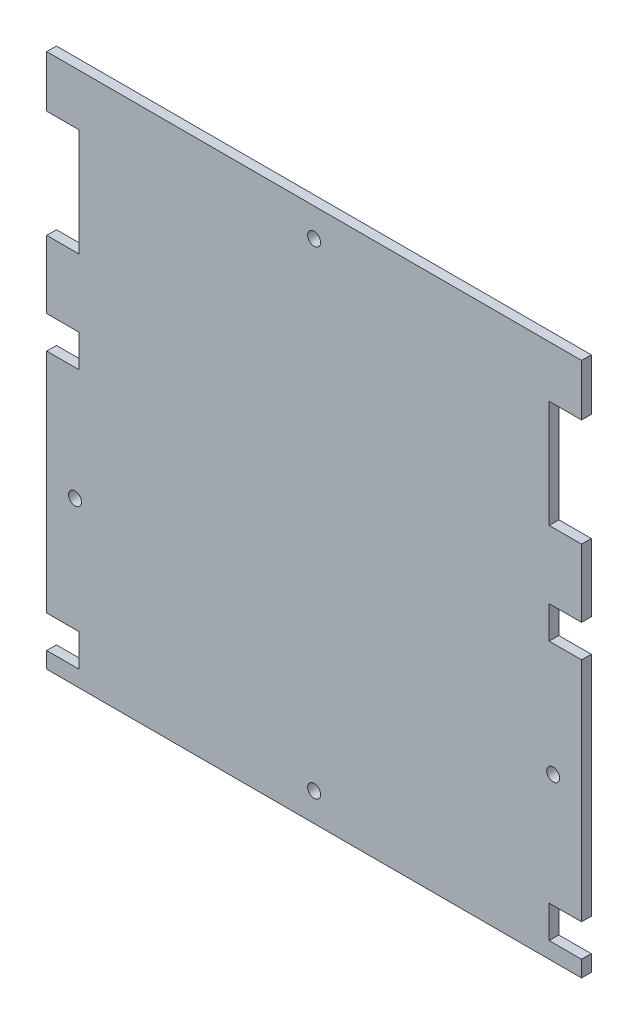
ISO-10303-21;
HEADER;
FILE_DESCRIPTION(('STEP AP214'),'2;1');
FILE_NAME('part.step','',(''),(''),'','','');
FILE_SCHEMA(('AUTOMOTIVE_DESIGN { 1 0 10303 214 1 1 1 1 }'));
ENDSEC;
DATA;
#1=APPLICATION_CONTEXT('core data for automotive mechanical design processes');
#2=APPLICATION_PROTOCOL_DEFINITION('international standard','automotive_design',2000,#1);
#3=PRODUCT_CONTEXT('',#1,'mechanical');
#4=PRODUCT('Part','Part','',(#3));
#5=PRODUCT_RELATED_PRODUCT_CATEGORY('part','',(#4));
#6=PRODUCT_DEFINITION_FORMATION('','',#4);
#7=PRODUCT_DEFINITION_CONTEXT('part definition',#1,'design');
#8=PRODUCT_DEFINITION('design','',#6,#7);
#9=PRODUCT_DEFINITION_SHAPE('','',#8);
#10=(LENGTH_UNIT() NAMED_UNIT(*) SI_UNIT(.MILLI.,.METRE.));
#11=(NAMED_UNIT(*) PLANE_ANGLE_UNIT() SI_UNIT($,.RADIAN.));
#12=(NAMED_UNIT(*) SI_UNIT($,.STERADIAN.) SOLID_ANGLE_UNIT());
#13=UNCERTAINTY_MEASURE_WITH_UNIT(LENGTH_MEASURE(1.E-05),#10,'distance_accuracy_value','');
#14=(GEOMETRIC_REPRESENTATION_CONTEXT(3) GLOBAL_UNCERTAINTY_ASSIGNED_CONTEXT((#13)) GLOBAL_UNIT_ASSIGNED_CONTEXT((#10,
#11,#12)) REPRESENTATION_CONTEXT('',''));
#15=CARTESIAN_POINT('',(0.,0.,0.));
#16=DIRECTION('',(0.,0.,1.));
#17=DIRECTION('',(1.,0.,0.));
#18=AXIS2_PLACEMENT_3D('',#15,#16,#17);
#19=CARTESIAN_POINT('',(0.,0.,3.));
#20=DIRECTION('',(0.,0.,1.));
#21=DIRECTION('',(1.,0.,0.));
#22=AXIS2_PLACEMENT_3D('',#19,#20,#21);
#23=PLANE('',#22);
#24=CARTESIAN_POINT('',(-7.2061657032755,-238.75,3.));
#25=DIRECTION('',(0.,0.,1.));
#26=DIRECTION('',(1.,0.,0.));
#27=AXIS2_PLACEMENT_3D('',#24,#25,#26);
#28=CIRCLE('',#27,2.);
#29=CARTESIAN_POINT('',(-5.2061657032755,-238.75,3.));
#30=VERTEX_POINT('',#29);
#31=EDGE_CURVE('E500',#30,#30,#28,.T.);
#32=ORIENTED_EDGE('',*,*,#31,.F.);
#33=EDGE_LOOP('',(#32));
#34=FACE_BOUND('',#33,.T.);
#35=CARTESIAN_POINT('',(-7.20616570327551,-91.25,3.));
#36=DIRECTION('',(0.,0.,1.));
#37=DIRECTION('',(1.,0.,0.));
#38=AXIS2_PLACEMENT_3D('',#35,#36,#37);
#39=CIRCLE('',#38,2.);
#40=CARTESIAN_POINT('',(-5.20616570327551,-91.25,3.));
#41=VERTEX_POINT('',#40);
#42=EDGE_CURVE('E254',#41,#41,#39,.T.);
#43=ORIENTED_EDGE('',*,*,#42,.F.);
#44=EDGE_LOOP('',(#43));
#45=FACE_BOUND('',#44,.T.);
#46=DIRECTION('',(0.,-1.,0.));
#47=VECTOR('',#46,1.);
#48=CARTESIAN_POINT('',(-89.7061657032755,-242.5,3.));
#49=LINE('',#48,#47);
#50=CARTESIAN_POINT('',(-89.7061657032755,-242.5,3.));
#51=VERTEX_POINT('',#50);
#52=CARTESIAN_POINT('',(-89.7061657032755,-247.5,3.));
#53=VERTEX_POINT('',#52);
#54=EDGE_CURVE('E305',#51,#53,#49,.T.);
#55=ORIENTED_EDGE('',*,*,#54,.T.);
#56=DIRECTION('',(1.,0.,0.));
#57=VECTOR('',#56,1.);
#58=CARTESIAN_POINT('',(-89.7061657032755,-247.5,3.));
#59=LINE('',#58,#57);
#60=CARTESIAN_POINT('',(75.2938342967245,-247.5,3.));
#61=VERTEX_POINT('',#60);
#62=EDGE_CURVE('E153',#53,#61,#59,.T.);
#63=ORIENTED_EDGE('',*,*,#62,.T.);
#64=DIRECTION('',(0.,1.,0.));
#65=VECTOR('',#64,1.);
#66=CARTESIAN_POINT('',(75.2938342967245,-247.5,3.));
#67=LINE('',#66,#65);
#68=CARTESIAN_POINT('',(75.2938342967245,-242.5,3.));
#69=VERTEX_POINT('',#68);
#70=EDGE_CURVE('E380',#61,#69,#67,.T.);
#71=ORIENTED_EDGE('',*,*,#70,.T.);
#72=DIRECTION('',(-1.,0.,0.));
#73=VECTOR('',#72,1.);
#74=CARTESIAN_POINT('',(75.2938342967245,-242.5,3.));
#75=LINE('',#74,#73);
#76=CARTESIAN_POINT('',(65.2938342967245,-242.5,3.));
#77=VERTEX_POINT('',#76);
#78=EDGE_CURVE('E399',#69,#77,#75,.T.);
#79=ORIENTED_EDGE('',*,*,#78,.T.);
#80=DIRECTION('',(0.,1.,0.));
#81=VECTOR('',#80,1.);
#82=CARTESIAN_POINT('',(65.2938342967245,-242.5,3.));
#83=LINE('',#82,#81);
#84=CARTESIAN_POINT('',(65.2938342967245,-232.5,3.));
#85=VERTEX_POINT('',#84);
#86=EDGE_CURVE('E396',#77,#85,#83,.T.);
#87=ORIENTED_EDGE('',*,*,#86,.T.);
#88=DIRECTION('',(1.,0.,0.));
#89=VECTOR('',#88,1.);
#90=CARTESIAN_POINT('',(65.2938342967245,-232.5,3.));
#91=LINE('',#90,#89);
#92=CARTESIAN_POINT('',(75.2938342967245,-232.5,3.));
#93=VERTEX_POINT('',#92);
#94=EDGE_CURVE('E398',#85,#93,#91,.T.);
#95=ORIENTED_EDGE('',*,*,#94,.T.);
#96=DIRECTION('',(0.,1.,0.));
#97=VECTOR('',#96,1.);
#98=CARTESIAN_POINT('',(75.2938342967245,-232.5,3.));
#99=LINE('',#98,#97);
#100=CARTESIAN_POINT('',(75.2938342967245,-162.5,3.));
#101=VERTEX_POINT('',#100);
#102=EDGE_CURVE('E401',#93,#101,#99,.T.);
#103=ORIENTED_EDGE('',*,*,#102,.T.);
#104=DIRECTION('',(-1.,0.,0.));
#105=VECTOR('',#104,1.);
#106=CARTESIAN_POINT('',(75.2938342967245,-162.5,3.));
#107=LINE('',#106,#105);
#108=CARTESIAN_POINT('',(65.2938342967245,-162.5,3.));
#109=VERTEX_POINT('',#108);
#110=EDGE_CURVE('E407',#101,#109,#107,.T.);
#111=ORIENTED_EDGE('',*,*,#110,.T.);
#112=DIRECTION('',(0.,1.,0.));
#113=VECTOR('',#112,1.);
#114=CARTESIAN_POINT('',(65.2938342967245,-162.5,3.));
#115=LINE('',#114,#113);
#116=CARTESIAN_POINT('',(65.2938342967245,-152.5,3.));
#117=VERTEX_POINT('',#116);
#118=EDGE_CURVE('E409',#109,#117,#115,.T.);
#119=ORIENTED_EDGE('',*,*,#118,.T.);
#120=DIRECTION('',(1.,0.,0.));
#121=VECTOR('',#120,1.);
#122=CARTESIAN_POINT('',(65.2938342967245,-152.5,3.));
#123=LINE('',#122,#121);
#124=CARTESIAN_POINT('',(75.2938342967245,-152.5,3.));
#125=VERTEX_POINT('',#124);
#126=EDGE_CURVE('E411',#117,#125,#123,.T.);
#127=ORIENTED_EDGE('',*,*,#126,.T.);
#128=DIRECTION('',(0.,1.,0.));
#129=VECTOR('',#128,1.);
#130=CARTESIAN_POINT('',(75.2938342967245,-152.5,3.));
#131=LINE('',#130,#129);
#132=CARTESIAN_POINT('',(75.2938342967245,-131.583123951777,3.));
#133=VERTEX_POINT('',#132);
#134=EDGE_CURVE('E413',#125,#133,#131,.T.);
#135=ORIENTED_EDGE('',*,*,#134,.T.);
#136=DIRECTION('',(-1.,0.,0.));
#137=VECTOR('',#136,1.);
#138=CARTESIAN_POINT('',(75.2938342967245,-131.583123951777,3.));
#139=LINE('',#138,#137);
#140=CARTESIAN_POINT('',(65.2938342967245,-131.583123951777,3.));
#141=VERTEX_POINT('',#140);
#142=EDGE_CURVE('E415',#133,#141,#139,.T.);
#143=ORIENTED_EDGE('',*,*,#142,.T.);
#144=DIRECTION('',(0.,1.,0.));
#145=VECTOR('',#144,1.);
#146=CARTESIAN_POINT('',(65.2938342967245,-131.583123951777,3.));
#147=LINE('',#146,#145);
#148=CARTESIAN_POINT('',(65.2938342967245,-98.416876048223,3.));
#149=VERTEX_POINT('',#148);
#150=EDGE_CURVE('E417',#141,#149,#147,.T.);
#151=ORIENTED_EDGE('',*,*,#150,.T.);
#152=DIRECTION('',(1.,0.,0.));
#153=VECTOR('',#152,1.);
#154=CARTESIAN_POINT('',(65.2938342967245,-98.416876048223,3.));
#155=LINE('',#154,#153);
#156=CARTESIAN_POINT('',(75.2938342967245,-98.416876048223,3.));
#157=VERTEX_POINT('',#156);
#158=EDGE_CURVE('E419',#149,#157,#155,.T.);
#159=ORIENTED_EDGE('',*,*,#158,.T.);
#160=DIRECTION('',(0.,1.,0.));
#161=VECTOR('',#160,1.);
#162=CARTESIAN_POINT('',(75.2938342967245,-98.416876048223,3.));
#163=LINE('',#162,#161);
#164=CARTESIAN_POINT('',(75.2938342967245,-82.5,3.));
#165=VERTEX_POINT('',#164);
#166=EDGE_CURVE('E421',#157,#165,#163,.T.);
#167=ORIENTED_EDGE('',*,*,#166,.T.);
#168=DIRECTION('',(-1.,0.,0.));
#169=VECTOR('',#168,1.);
#170=CARTESIAN_POINT('',(75.2938342967245,-82.5,3.));
#171=LINE('',#170,#169);
#172=CARTESIAN_POINT('',(-89.7061657032755,-82.5,3.));
#173=VERTEX_POINT('',#172);
#174=EDGE_CURVE('E423',#165,#173,#171,.T.);
#175=ORIENTED_EDGE('',*,*,#174,.T.);
#176=DIRECTION('',(0.,-1.,0.));
#177=VECTOR('',#176,1.);
#178=CARTESIAN_POINT('',(-89.7061657032755,-82.5,3.));
#179=LINE('',#178,#177);
#180=CARTESIAN_POINT('',(-89.7061657032755,-98.416876048223,3.));
#181=VERTEX_POINT('',#180);
#182=EDGE_CURVE('E425',#173,#181,#179,.T.);
#183=ORIENTED_EDGE('',*,*,#182,.T.);
#184=DIRECTION('',(1.,0.,0.));
#185=VECTOR('',#184,1.);
#186=CARTESIAN_POINT('',(-89.7061657032755,-98.416876048223,3.));
#187=LINE('',#186,#185);
#188=CARTESIAN_POINT('',(-79.7061657032755,-98.416876048223,3.));
#189=VERTEX_POINT('',#188);
#190=EDGE_CURVE('E427',#181,#189,#187,.T.);
#191=ORIENTED_EDGE('',*,*,#190,.T.);
#192=DIRECTION('',(0.,-1.,0.));
#193=VECTOR('',#192,1.);
#194=CARTESIAN_POINT('',(-79.7061657032755,-98.416876048223,3.));
#195=LINE('',#194,#193);
#196=CARTESIAN_POINT('',(-79.7061657032755,-131.583123951777,3.));
#197=VERTEX_POINT('',#196);
#198=EDGE_CURVE('E429',#189,#197,#195,.T.);
#199=ORIENTED_EDGE('',*,*,#198,.T.);
#200=DIRECTION('',(-1.,0.,0.));
#201=VECTOR('',#200,1.);
#202=CARTESIAN_POINT('',(-79.7061657032755,-131.583123951777,3.));
#203=LINE('',#202,#201);
#204=CARTESIAN_POINT('',(-89.7061657032755,-131.583123951777,3.));
#205=VERTEX_POINT('',#204);
#206=EDGE_CURVE('E431',#197,#205,#203,.T.);
#207=ORIENTED_EDGE('',*,*,#206,.T.);
#208=DIRECTION('',(0.,-1.,0.));
#209=VECTOR('',#208,1.);
#210=CARTESIAN_POINT('',(-89.7061657032755,-131.583123951777,3.));
#211=LINE('',#210,#209);
#212=CARTESIAN_POINT('',(-89.7061657032755,-152.5,3.));
#213=VERTEX_POINT('',#212);
#214=EDGE_CURVE('E433',#205,#213,#211,.T.);
#215=ORIENTED_EDGE('',*,*,#214,.T.);
#216=DIRECTION('',(1.,0.,0.));
#217=VECTOR('',#216,1.);
#218=CARTESIAN_POINT('',(-89.7061657032755,-152.5,3.));
#219=LINE('',#218,#217);
#220=CARTESIAN_POINT('',(-79.7061657032755,-152.5,3.));
#221=VERTEX_POINT('',#220);
#222=EDGE_CURVE('E435',#213,#221,#219,.T.);
#223=ORIENTED_EDGE('',*,*,#222,.T.);
#224=DIRECTION('',(0.,-1.,0.));
#225=VECTOR('',#224,1.);
#226=CARTESIAN_POINT('',(-79.7061657032755,-152.5,3.));
#227=LINE('',#226,#225);
#228=CARTESIAN_POINT('',(-79.7061657032755,-162.5,3.));
#229=VERTEX_POINT('',#228);
#230=EDGE_CURVE('E437',#221,#229,#227,.T.);
#231=ORIENTED_EDGE('',*,*,#230,.T.);
#232=DIRECTION('',(-1.,0.,0.));
#233=VECTOR('',#232,1.);
#234=CARTESIAN_POINT('',(-79.7061657032755,-162.5,3.));
#235=LINE('',#234,#233);
#236=CARTESIAN_POINT('',(-89.7061657032755,-162.5,3.));
#237=VERTEX_POINT('',#236);
#238=EDGE_CURVE('E439',#229,#237,#235,.T.);
#239=ORIENTED_EDGE('',*,*,#238,.T.);
#240=DIRECTION('',(0.,-1.,0.));
#241=VECTOR('',#240,1.);
#242=CARTESIAN_POINT('',(-89.7061657032755,-162.5,3.));
#243=LINE('',#242,#241);
#244=CARTESIAN_POINT('',(-89.7061657032755,-232.5,3.));
#245=VERTEX_POINT('',#244);
#246=EDGE_CURVE('E232',#237,#245,#243,.T.);
#247=ORIENTED_EDGE('',*,*,#246,.T.);
#248=DIRECTION('',(1.,0.,0.));
#249=VECTOR('',#248,1.);
#250=CARTESIAN_POINT('',(-89.7061657032755,-232.5,3.));
#251=LINE('',#250,#249);
#252=CARTESIAN_POINT('',(-79.7061657032755,-232.5,3.));
#253=VERTEX_POINT('',#252);
#254=EDGE_CURVE('E226',#245,#253,#251,.T.);
#255=ORIENTED_EDGE('',*,*,#254,.T.);
#256=DIRECTION('',(0.,-1.,0.));
#257=VECTOR('',#256,1.);
#258=CARTESIAN_POINT('',(-79.7061657032755,-232.5,3.));
#259=LINE('',#258,#257);
#260=CARTESIAN_POINT('',(-79.7061657032755,-242.5,3.));
#261=VERTEX_POINT('',#260);
#262=EDGE_CURVE('E230',#253,#261,#259,.T.);
#263=ORIENTED_EDGE('',*,*,#262,.T.);
#264=DIRECTION('',(-1.,0.,0.));
#265=VECTOR('',#264,1.);
#266=CARTESIAN_POINT('',(-79.7061657032755,-242.5,3.));
#267=LINE('',#266,#265);
#268=EDGE_CURVE('E50',#261,#51,#267,.T.);
#269=ORIENTED_EDGE('',*,*,#268,.T.);
#270=EDGE_LOOP('',(#55,#63,#71,#79,#87,#95,#103,#111,#119,#127,#135,#143,#151,#159,#167,#175,
#183,#191,#199,#207,#215,#223,#231,#239,#247,#255,#263,#269));
#271=FACE_BOUND('',#270,.T.);
#272=CARTESIAN_POINT('',(-80.9561657032755,-197.5,3.));
#273=DIRECTION('',(0.,0.,1.));
#274=DIRECTION('',(1.,0.,0.));
#275=AXIS2_PLACEMENT_3D('',#272,#273,#274);
#276=CIRCLE('',#275,2.);
#277=CARTESIAN_POINT('',(-78.9561657032755,-197.5,3.));
#278=VERTEX_POINT('',#277);
#279=EDGE_CURVE('E506',#278,#278,#276,.T.);
#280=ORIENTED_EDGE('',*,*,#279,.F.);
#281=EDGE_LOOP('',(#280));
#282=FACE_BOUND('',#281,.T.);
#283=CARTESIAN_POINT('',(66.5438342967245,-197.5,3.));
#284=DIRECTION('',(0.,0.,1.));
#285=DIRECTION('',(1.,0.,0.));
#286=AXIS2_PLACEMENT_3D('',#283,#284,#285);
#287=CIRCLE('',#286,1.99999999999998);
#288=CARTESIAN_POINT('',(68.5438342967245,-197.5,3.));
#289=VERTEX_POINT('',#288);
#290=EDGE_CURVE('E491',#289,#289,#287,.T.);
#291=ORIENTED_EDGE('',*,*,#290,.F.);
#292=EDGE_LOOP('',(#291));
#293=FACE_BOUND('',#292,.T.);
#294=ADVANCED_FACE('F33',(#34,#45,#271,#282,#293),#23,.T.);
#295=CARTESIAN_POINT('',(0.,0.,0.));
#296=DIRECTION('',(0.,0.,1.));
#297=DIRECTION('',(1.,0.,0.));
#298=AXIS2_PLACEMENT_3D('',#295,#296,#297);
#299=PLANE('',#298);
#300=CARTESIAN_POINT('',(-7.2061657032755,-238.75,0.));
#301=DIRECTION('',(0.,0.,1.));
#302=DIRECTION('',(1.,0.,0.));
#303=AXIS2_PLACEMENT_3D('',#300,#301,#302);
#304=CIRCLE('',#303,2.);
#305=CARTESIAN_POINT('',(-5.2061657032755,-238.75,0.));
#306=VERTEX_POINT('',#305);
#307=EDGE_CURVE('E497',#306,#306,#304,.T.);
#308=ORIENTED_EDGE('',*,*,#307,.T.);
#309=EDGE_LOOP('',(#308));
#310=FACE_BOUND('',#309,.T.);
#311=CARTESIAN_POINT('',(-7.20616570327551,-91.25,0.));
#312=DIRECTION('',(0.,0.,1.));
#313=DIRECTION('',(1.,0.,0.));
#314=AXIS2_PLACEMENT_3D('',#311,#312,#313);
#315=CIRCLE('',#314,2.);
#316=CARTESIAN_POINT('',(-5.20616570327551,-91.25,0.));
#317=VERTEX_POINT('',#316);
#318=EDGE_CURVE('E509',#317,#317,#315,.T.);
#319=ORIENTED_EDGE('',*,*,#318,.T.);
#320=EDGE_LOOP('',(#319));
#321=FACE_BOUND('',#320,.T.);
#322=DIRECTION('',(0.,-1.,0.));
#323=VECTOR('',#322,1.);
#324=CARTESIAN_POINT('',(-89.7061657032755,-242.5,0.));
#325=LINE('',#324,#323);
#326=CARTESIAN_POINT('',(-89.7061657032755,-242.5,0.));
#327=VERTEX_POINT('',#326);
#328=CARTESIAN_POINT('',(-89.7061657032755,-247.5,0.));
#329=VERTEX_POINT('',#328);
#330=EDGE_CURVE('E250',#327,#329,#325,.T.);
#331=ORIENTED_EDGE('',*,*,#330,.F.);
#332=DIRECTION('',(-1.,0.,0.));
#333=VECTOR('',#332,1.);
#334=CARTESIAN_POINT('',(-79.7061657032755,-242.5,0.));
#335=LINE('',#334,#333);
#336=CARTESIAN_POINT('',(-79.7061657032755,-242.5,0.));
#337=VERTEX_POINT('',#336);
#338=EDGE_CURVE('E145',#337,#327,#335,.T.);
#339=ORIENTED_EDGE('',*,*,#338,.F.);
#340=DIRECTION('',(0.,-1.,0.));
#341=VECTOR('',#340,1.);
#342=CARTESIAN_POINT('',(-79.7061657032755,-232.5,0.));
#343=LINE('',#342,#341);
#344=CARTESIAN_POINT('',(-79.7061657032755,-232.5,0.));
#345=VERTEX_POINT('',#344);
#346=EDGE_CURVE('E139',#345,#337,#343,.T.);
#347=ORIENTED_EDGE('',*,*,#346,.F.);
#348=DIRECTION('',(1.,0.,0.));
#349=VECTOR('',#348,1.);
#350=CARTESIAN_POINT('',(-89.7061657032755,-232.5,0.));
#351=LINE('',#350,#349);
#352=CARTESIAN_POINT('',(-89.7061657032755,-232.5,0.));
#353=VERTEX_POINT('',#352);
#354=EDGE_CURVE('E240',#353,#345,#351,.T.);
#355=ORIENTED_EDGE('',*,*,#354,.F.);
#356=DIRECTION('',(0.,-1.,0.));
#357=VECTOR('',#356,1.);
#358=CARTESIAN_POINT('',(-89.7061657032755,-162.5,0.));
#359=LINE('',#358,#357);
#360=CARTESIAN_POINT('',(-89.7061657032755,-162.5,0.));
#361=VERTEX_POINT('',#360);
#362=EDGE_CURVE('E300',#361,#353,#359,.T.);
#363=ORIENTED_EDGE('',*,*,#362,.F.);
#364=DIRECTION('',(-1.,0.,0.));
#365=VECTOR('',#364,1.);
#366=CARTESIAN_POINT('',(-79.7061657032755,-162.5,0.));
#367=LINE('',#366,#365);
#368=CARTESIAN_POINT('',(-79.7061657032755,-162.5,0.));
#369=VERTEX_POINT('',#368);
#370=EDGE_CURVE('E298',#369,#361,#367,.T.);
#371=ORIENTED_EDGE('',*,*,#370,.F.);
#372=DIRECTION('',(0.,-1.,0.));
#373=VECTOR('',#372,1.);
#374=CARTESIAN_POINT('',(-79.7061657032755,-152.5,0.));
#375=LINE('',#374,#373);
#376=CARTESIAN_POINT('',(-79.7061657032755,-152.5,0.));
#377=VERTEX_POINT('',#376);
#378=EDGE_CURVE('E296',#377,#369,#375,.T.);
#379=ORIENTED_EDGE('',*,*,#378,.F.);
#380=DIRECTION('',(1.,0.,0.));
#381=VECTOR('',#380,1.);
#382=CARTESIAN_POINT('',(-89.7061657032755,-152.5,0.));
#383=LINE('',#382,#381);
#384=CARTESIAN_POINT('',(-89.7061657032755,-152.5,0.));
#385=VERTEX_POINT('',#384);
#386=EDGE_CURVE('E294',#385,#377,#383,.T.);
#387=ORIENTED_EDGE('',*,*,#386,.F.);
#388=DIRECTION('',(0.,-1.,0.));
#389=VECTOR('',#388,1.);
#390=CARTESIAN_POINT('',(-89.7061657032755,-131.583123951777,0.));
#391=LINE('',#390,#389);
#392=CARTESIAN_POINT('',(-89.7061657032755,-131.583123951777,0.));
#393=VERTEX_POINT('',#392);
#394=EDGE_CURVE('E292',#393,#385,#391,.T.);
#395=ORIENTED_EDGE('',*,*,#394,.F.);
#396=DIRECTION('',(-1.,0.,0.));
#397=VECTOR('',#396,1.);
#398=CARTESIAN_POINT('',(-79.7061657032755,-131.583123951777,0.));
#399=LINE('',#398,#397);
#400=CARTESIAN_POINT('',(-79.7061657032755,-131.583123951777,0.));
#401=VERTEX_POINT('',#400);
#402=EDGE_CURVE('E290',#401,#393,#399,.T.);
#403=ORIENTED_EDGE('',*,*,#402,.F.);
#404=DIRECTION('',(0.,-1.,0.));
#405=VECTOR('',#404,1.);
#406=CARTESIAN_POINT('',(-79.7061657032755,-98.416876048223,0.));
#407=LINE('',#406,#405);
#408=CARTESIAN_POINT('',(-79.7061657032755,-98.416876048223,0.));
#409=VERTEX_POINT('',#408);
#410=EDGE_CURVE('E288',#409,#401,#407,.T.);
#411=ORIENTED_EDGE('',*,*,#410,.F.);
#412=DIRECTION('',(1.,0.,0.));
#413=VECTOR('',#412,1.);
#414=CARTESIAN_POINT('',(-89.7061657032755,-98.416876048223,0.));
#415=LINE('',#414,#413);
#416=CARTESIAN_POINT('',(-89.7061657032755,-98.416876048223,0.));
#417=VERTEX_POINT('',#416);
#418=EDGE_CURVE('E286',#417,#409,#415,.T.);
#419=ORIENTED_EDGE('',*,*,#418,.F.);
#420=DIRECTION('',(0.,-1.,0.));
#421=VECTOR('',#420,1.);
#422=CARTESIAN_POINT('',(-89.7061657032755,-82.5,0.));
#423=LINE('',#422,#421);
#424=CARTESIAN_POINT('',(-89.7061657032755,-82.5,0.));
#425=VERTEX_POINT('',#424);
#426=EDGE_CURVE('E284',#425,#417,#423,.T.);
#427=ORIENTED_EDGE('',*,*,#426,.F.);
#428=DIRECTION('',(-1.,0.,0.));
#429=VECTOR('',#428,1.);
#430=CARTESIAN_POINT('',(75.2938342967245,-82.5,0.));
#431=LINE('',#430,#429);
#432=CARTESIAN_POINT('',(75.2938342967245,-82.5,0.));
#433=VERTEX_POINT('',#432);
#434=EDGE_CURVE('E282',#433,#425,#431,.T.);
#435=ORIENTED_EDGE('',*,*,#434,.F.);
#436=DIRECTION('',(0.,1.,0.));
#437=VECTOR('',#436,1.);
#438=CARTESIAN_POINT('',(75.2938342967245,-98.416876048223,0.));
#439=LINE('',#438,#437);
#440=CARTESIAN_POINT('',(75.2938342967245,-98.416876048223,0.));
#441=VERTEX_POINT('',#440);
#442=EDGE_CURVE('E280',#441,#433,#439,.T.);
#443=ORIENTED_EDGE('',*,*,#442,.F.);
#444=DIRECTION('',(1.,0.,0.));
#445=VECTOR('',#444,1.);
#446=CARTESIAN_POINT('',(65.2938342967245,-98.416876048223,0.));
#447=LINE('',#446,#445);
#448=CARTESIAN_POINT('',(65.2938342967245,-98.416876048223,0.));
#449=VERTEX_POINT('',#448);
#450=EDGE_CURVE('E278',#449,#441,#447,.T.);
#451=ORIENTED_EDGE('',*,*,#450,.F.);
#452=DIRECTION('',(0.,1.,0.));
#453=VECTOR('',#452,1.);
#454=CARTESIAN_POINT('',(65.2938342967245,-131.583123951777,0.));
#455=LINE('',#454,#453);
#456=CARTESIAN_POINT('',(65.2938342967245,-131.583123951777,0.));
#457=VERTEX_POINT('',#456);
#458=EDGE_CURVE('E276',#457,#449,#455,.T.);
#459=ORIENTED_EDGE('',*,*,#458,.F.);
#460=DIRECTION('',(-1.,0.,0.));
#461=VECTOR('',#460,1.);
#462=CARTESIAN_POINT('',(75.2938342967245,-131.583123951777,0.));
#463=LINE('',#462,#461);
#464=CARTESIAN_POINT('',(75.2938342967245,-131.583123951777,0.));
#465=VERTEX_POINT('',#464);
#466=EDGE_CURVE('E274',#465,#457,#463,.T.);
#467=ORIENTED_EDGE('',*,*,#466,.F.);
#468=DIRECTION('',(0.,1.,0.));
#469=VECTOR('',#468,1.);
#470=CARTESIAN_POINT('',(75.2938342967245,-152.5,0.));
#471=LINE('',#470,#469);
#472=CARTESIAN_POINT('',(75.2938342967245,-152.5,0.));
#473=VERTEX_POINT('',#472);
#474=EDGE_CURVE('E272',#473,#465,#471,.T.);
#475=ORIENTED_EDGE('',*,*,#474,.F.);
#476=DIRECTION('',(1.,0.,0.));
#477=VECTOR('',#476,1.);
#478=CARTESIAN_POINT('',(65.2938342967245,-152.5,0.));
#479=LINE('',#478,#477);
#480=CARTESIAN_POINT('',(65.2938342967245,-152.5,0.));
#481=VERTEX_POINT('',#480);
#482=EDGE_CURVE('E270',#481,#473,#479,.T.);
#483=ORIENTED_EDGE('',*,*,#482,.F.);
#484=DIRECTION('',(0.,1.,0.));
#485=VECTOR('',#484,1.);
#486=CARTESIAN_POINT('',(65.2938342967245,-162.5,0.));
#487=LINE('',#486,#485);
#488=CARTESIAN_POINT('',(65.2938342967245,-162.5,0.));
#489=VERTEX_POINT('',#488);
#490=EDGE_CURVE('E268',#489,#481,#487,.T.);
#491=ORIENTED_EDGE('',*,*,#490,.F.);
#492=DIRECTION('',(-1.,0.,0.));
#493=VECTOR('',#492,1.);
#494=CARTESIAN_POINT('',(75.2938342967245,-162.5,0.));
#495=LINE('',#494,#493);
#496=CARTESIAN_POINT('',(75.2938342967245,-162.5,0.));
#497=VERTEX_POINT('',#496);
#498=EDGE_CURVE('E266',#497,#489,#495,.T.);
#499=ORIENTED_EDGE('',*,*,#498,.F.);
#500=DIRECTION('',(0.,1.,0.));
#501=VECTOR('',#500,1.);
#502=CARTESIAN_POINT('',(75.2938342967245,-232.5,0.));
#503=LINE('',#502,#501);
#504=CARTESIAN_POINT('',(75.2938342967245,-232.5,0.));
#505=VERTEX_POINT('',#504);
#506=EDGE_CURVE('E264',#505,#497,#503,.T.);
#507=ORIENTED_EDGE('',*,*,#506,.F.);
#508=DIRECTION('',(1.,0.,0.));
#509=VECTOR('',#508,1.);
#510=CARTESIAN_POINT('',(65.2938342967245,-232.5,0.));
#511=LINE('',#510,#509);
#512=CARTESIAN_POINT('',(65.2938342967245,-232.5,0.));
#513=VERTEX_POINT('',#512);
#514=EDGE_CURVE('E262',#513,#505,#511,.T.);
#515=ORIENTED_EDGE('',*,*,#514,.F.);
#516=DIRECTION('',(0.,1.,0.));
#517=VECTOR('',#516,1.);
#518=CARTESIAN_POINT('',(65.2938342967245,-242.5,0.));
#519=LINE('',#518,#517);
#520=CARTESIAN_POINT('',(65.2938342967245,-242.5,0.));
#521=VERTEX_POINT('',#520);
#522=EDGE_CURVE('E260',#521,#513,#519,.T.);
#523=ORIENTED_EDGE('',*,*,#522,.F.);
#524=DIRECTION('',(-1.,0.,0.));
#525=VECTOR('',#524,1.);
#526=CARTESIAN_POINT('',(75.2938342967245,-242.5,0.));
#527=LINE('',#526,#525);
#528=CARTESIAN_POINT('',(75.2938342967245,-242.5,0.));
#529=VERTEX_POINT('',#528);
#530=EDGE_CURVE('E258',#529,#521,#527,.T.);
#531=ORIENTED_EDGE('',*,*,#530,.F.);
#532=DIRECTION('',(0.,1.,0.));
#533=VECTOR('',#532,1.);
#534=CARTESIAN_POINT('',(75.2938342967245,-247.5,0.));
#535=LINE('',#534,#533);
#536=CARTESIAN_POINT('',(75.2938342967245,-247.5,0.));
#537=VERTEX_POINT('',#536);
#538=EDGE_CURVE('E256',#537,#529,#535,.T.);
#539=ORIENTED_EDGE('',*,*,#538,.F.);
#540=DIRECTION('',(1.,0.,0.));
#541=VECTOR('',#540,1.);
#542=CARTESIAN_POINT('',(-89.7061657032755,-247.5,0.));
#543=LINE('',#542,#541);
#544=EDGE_CURVE('E253',#329,#537,#543,.T.);
#545=ORIENTED_EDGE('',*,*,#544,.F.);
#546=EDGE_LOOP('',(#331,#339,#347,#355,#363,#371,#379,#387,#395,#403,#411,#419,#427,#435,#443,
#451,#459,#467,#475,#483,#491,#499,#507,#515,#523,#531,#539,#545));
#547=FACE_BOUND('',#546,.T.);
#548=CARTESIAN_POINT('',(-80.9561657032755,-197.5,0.));
#549=DIRECTION('',(0.,0.,1.));
#550=DIRECTION('',(1.,0.,0.));
#551=AXIS2_PLACEMENT_3D('',#548,#549,#550);
#552=CIRCLE('',#551,2.);
#553=CARTESIAN_POINT('',(-78.9561657032755,-197.5,0.));
#554=VERTEX_POINT('',#553);
#555=EDGE_CURVE('E503',#554,#554,#552,.T.);
#556=ORIENTED_EDGE('',*,*,#555,.T.);
#557=EDGE_LOOP('',(#556));
#558=FACE_BOUND('',#557,.T.);
#559=CARTESIAN_POINT('',(66.5438342967245,-197.5,0.));
#560=DIRECTION('',(0.,0.,1.));
#561=DIRECTION('',(1.,0.,0.));
#562=AXIS2_PLACEMENT_3D('',#559,#560,#561);
#563=CIRCLE('',#562,1.99999999999998);
#564=CARTESIAN_POINT('',(68.5438342967245,-197.5,0.));
#565=VERTEX_POINT('',#564);
#566=EDGE_CURVE('E494',#565,#565,#563,.T.);
#567=ORIENTED_EDGE('',*,*,#566,.T.);
#568=EDGE_LOOP('',(#567));
#569=FACE_BOUND('',#568,.T.);
#570=ADVANCED_FACE('F384',(#310,#321,#547,#558,#569),#299,.F.);
#571=CARTESIAN_POINT('',(-89.7061657032755,-242.5,3.));
#572=DIRECTION('',(1.,0.,0.));
#573=DIRECTION('',(0.,1.,0.));
#574=AXIS2_PLACEMENT_3D('',#571,#572,#573);
#575=PLANE('',#574);
#576=ORIENTED_EDGE('',*,*,#330,.T.);
#577=DIRECTION('',(0.,0.,-1.));
#578=VECTOR('',#577,1.);
#579=CARTESIAN_POINT('',(-89.7061657032755,-247.5,3.));
#580=LINE('',#579,#578);
#581=EDGE_CURVE('E11',#53,#329,#580,.T.);
#582=ORIENTED_EDGE('',*,*,#581,.F.);
#583=ORIENTED_EDGE('',*,*,#54,.F.);
#584=DIRECTION('',(0.,0.,-1.));
#585=VECTOR('',#584,1.);
#586=CARTESIAN_POINT('',(-89.7061657032755,-242.5,3.));
#587=LINE('',#586,#585);
#588=EDGE_CURVE('E246',#51,#327,#587,.T.);
#589=ORIENTED_EDGE('',*,*,#588,.T.);
#590=EDGE_LOOP('',(#576,#582,#583,#589));
#591=FACE_BOUND('',#590,.T.);
#592=ADVANCED_FACE('F35',(#591),#575,.F.);
#593=CARTESIAN_POINT('',(-89.7061657032755,-247.5,3.));
#594=DIRECTION('',(0.,1.,0.));
#595=DIRECTION('',(-1.,0.,0.));
#596=AXIS2_PLACEMENT_3D('',#593,#594,#595);
#597=PLANE('',#596);
#598=ORIENTED_EDGE('',*,*,#544,.T.);
#599=DIRECTION('',(0.,0.,-1.));
#600=VECTOR('',#599,1.);
#601=CARTESIAN_POINT('',(75.2938342967245,-247.5,3.));
#602=LINE('',#601,#600);
#603=EDGE_CURVE('E42',#61,#537,#602,.T.);
#604=ORIENTED_EDGE('',*,*,#603,.F.);
#605=ORIENTED_EDGE('',*,*,#62,.F.);
#606=ORIENTED_EDGE('',*,*,#581,.T.);
#607=EDGE_LOOP('',(#598,#604,#605,#606));
#608=FACE_BOUND('',#607,.T.);
#609=ADVANCED_FACE('F778',(#608),#597,.F.);
#610=CARTESIAN_POINT('',(75.2938342967245,-247.5,3.));
#611=DIRECTION('',(-1.,0.,0.));
#612=DIRECTION('',(0.,-1.,0.));
#613=AXIS2_PLACEMENT_3D('',#610,#611,#612);
#614=PLANE('',#613);
#615=ORIENTED_EDGE('',*,*,#538,.T.);
#616=DIRECTION('',(0.,0.,-1.));
#617=VECTOR('',#616,1.);
#618=CARTESIAN_POINT('',(75.2938342967245,-242.5,3.));
#619=LINE('',#618,#617);
#620=EDGE_CURVE('E372',#69,#529,#619,.T.);
#621=ORIENTED_EDGE('',*,*,#620,.F.);
#622=ORIENTED_EDGE('',*,*,#70,.F.);
#623=ORIENTED_EDGE('',*,*,#603,.T.);
#624=EDGE_LOOP('',(#615,#621,#622,#623));
#625=FACE_BOUND('',#624,.T.);
#626=ADVANCED_FACE('F378',(#625),#614,.F.);
#627=CARTESIAN_POINT('',(75.2938342967245,-242.5,3.));
#628=DIRECTION('',(0.,-1.,0.));
#629=DIRECTION('',(0.,0.,-1.));
#630=AXIS2_PLACEMENT_3D('',#627,#628,#629);
#631=PLANE('',#630);
#632=ORIENTED_EDGE('',*,*,#530,.T.);
#633=DIRECTION('',(0.,0.,-1.));
#634=VECTOR('',#633,1.);
#635=CARTESIAN_POINT('',(65.2938342967245,-242.5,3.));
#636=LINE('',#635,#634);
#637=EDGE_CURVE('E369',#77,#521,#636,.T.);
#638=ORIENTED_EDGE('',*,*,#637,.F.);
#639=ORIENTED_EDGE('',*,*,#78,.F.);
#640=ORIENTED_EDGE('',*,*,#620,.T.);
#641=EDGE_LOOP('',(#632,#638,#639,#640));
#642=FACE_BOUND('',#641,.T.);
#643=ADVANCED_FACE('F390',(#642),#631,.F.);
#644=CARTESIAN_POINT('',(65.2938342967245,-242.5,3.));
#645=DIRECTION('',(-1.,0.,0.));
#646=DIRECTION('',(0.,0.,1.));
#647=AXIS2_PLACEMENT_3D('',#644,#645,#646);
#648=PLANE('',#647);
#649=ORIENTED_EDGE('',*,*,#522,.T.);
#650=DIRECTION('',(0.,0.,-1.));
#651=VECTOR('',#650,1.);
#652=CARTESIAN_POINT('',(65.2938342967245,-232.5,3.));
#653=LINE('',#652,#651);
#654=EDGE_CURVE('E366',#85,#513,#653,.T.);
#655=ORIENTED_EDGE('',*,*,#654,.F.);
#656=ORIENTED_EDGE('',*,*,#86,.F.);
#657=ORIENTED_EDGE('',*,*,#637,.T.);
#658=EDGE_LOOP('',(#649,#655,#656,#657));
#659=FACE_BOUND('',#658,.T.);
#660=ADVANCED_FACE('F394',(#659),#648,.F.);
#661=CARTESIAN_POINT('',(65.2938342967245,-232.5,3.));
#662=DIRECTION('',(0.,1.,0.));
#663=DIRECTION('',(0.,0.,1.));
#664=AXIS2_PLACEMENT_3D('',#661,#662,#663);
#665=PLANE('',#664);
#666=ORIENTED_EDGE('',*,*,#514,.T.);
#667=DIRECTION('',(0.,0.,-1.));
#668=VECTOR('',#667,1.);
#669=CARTESIAN_POINT('',(75.2938342967245,-232.5,3.));
#670=LINE('',#669,#668);
#671=EDGE_CURVE('E363',#93,#505,#670,.T.);
#672=ORIENTED_EDGE('',*,*,#671,.F.);
#673=ORIENTED_EDGE('',*,*,#94,.F.);
#674=ORIENTED_EDGE('',*,*,#654,.T.);
#675=EDGE_LOOP('',(#666,#672,#673,#674));
#676=FACE_BOUND('',#675,.T.);
#677=ADVANCED_FACE('F743',(#676),#665,.F.);
#678=CARTESIAN_POINT('',(75.2938342967245,-232.5,3.));
#679=DIRECTION('',(-1.,0.,0.));
#680=DIRECTION('',(0.,0.,1.));
#681=AXIS2_PLACEMENT_3D('',#678,#679,#680);
#682=PLANE('',#681);
#683=ORIENTED_EDGE('',*,*,#506,.T.);
#684=DIRECTION('',(0.,0.,-1.));
#685=VECTOR('',#684,1.);
#686=CARTESIAN_POINT('',(75.2938342967245,-162.5,3.));
#687=LINE('',#686,#685);
#688=EDGE_CURVE('E360',#101,#497,#687,.T.);
#689=ORIENTED_EDGE('',*,*,#688,.F.);
#690=ORIENTED_EDGE('',*,*,#102,.F.);
#691=ORIENTED_EDGE('',*,*,#671,.T.);
#692=EDGE_LOOP('',(#683,#689,#690,#691));
#693=FACE_BOUND('',#692,.T.);
#694=ADVANCED_FACE('F733',(#693),#682,.F.);
#695=CARTESIAN_POINT('',(75.2938342967245,-162.5,3.));
#696=DIRECTION('',(0.,-1.,0.));
#697=DIRECTION('',(0.,0.,-1.));
#698=AXIS2_PLACEMENT_3D('',#695,#696,#697);
#699=PLANE('',#698);
#700=ORIENTED_EDGE('',*,*,#498,.T.);
#701=DIRECTION('',(0.,0.,-1.));
#702=VECTOR('',#701,1.);
#703=CARTESIAN_POINT('',(65.2938342967245,-162.5,3.));
#704=LINE('',#703,#702);
#705=EDGE_CURVE('E357',#109,#489,#704,.T.);
#706=ORIENTED_EDGE('',*,*,#705,.F.);
#707=ORIENTED_EDGE('',*,*,#110,.F.);
#708=ORIENTED_EDGE('',*,*,#688,.T.);
#709=EDGE_LOOP('',(#700,#706,#707,#708));
#710=FACE_BOUND('',#709,.T.);
#711=ADVANCED_FACE('F723',(#710),#699,.F.);
#712=CARTESIAN_POINT('',(65.2938342967245,-162.5,3.));
#713=DIRECTION('',(-1.,0.,0.));
#714=DIRECTION('',(0.,0.,1.));
#715=AXIS2_PLACEMENT_3D('',#712,#713,#714);
#716=PLANE('',#715);
#717=ORIENTED_EDGE('',*,*,#490,.T.);
#718=DIRECTION('',(0.,0.,-1.));
#719=VECTOR('',#718,1.);
#720=CARTESIAN_POINT('',(65.2938342967245,-152.5,3.));
#721=LINE('',#720,#719);
#722=EDGE_CURVE('E354',#117,#481,#721,.T.);
#723=ORIENTED_EDGE('',*,*,#722,.F.);
#724=ORIENTED_EDGE('',*,*,#118,.F.);
#725=ORIENTED_EDGE('',*,*,#705,.T.);
#726=EDGE_LOOP('',(#717,#723,#724,#725));
#727=FACE_BOUND('',#726,.T.);
#728=ADVANCED_FACE('F713',(#727),#716,.F.);
#729=CARTESIAN_POINT('',(65.2938342967245,-152.5,3.));
#730=DIRECTION('',(0.,1.,0.));
#731=DIRECTION('',(0.,0.,1.));
#732=AXIS2_PLACEMENT_3D('',#729,#730,#731);
#733=PLANE('',#732);
#734=ORIENTED_EDGE('',*,*,#482,.T.);
#735=DIRECTION('',(0.,0.,-1.));
#736=VECTOR('',#735,1.);
#737=CARTESIAN_POINT('',(75.2938342967245,-152.5,3.));
#738=LINE('',#737,#736);
#739=EDGE_CURVE('E351',#125,#473,#738,.T.);
#740=ORIENTED_EDGE('',*,*,#739,.F.);
#741=ORIENTED_EDGE('',*,*,#126,.F.);
#742=ORIENTED_EDGE('',*,*,#722,.T.);
#743=EDGE_LOOP('',(#734,#740,#741,#742));
#744=FACE_BOUND('',#743,.T.);
#745=ADVANCED_FACE('F703',(#744),#733,.F.);
#746=CARTESIAN_POINT('',(75.2938342967245,-152.5,3.));
#747=DIRECTION('',(-1.,0.,0.));
#748=DIRECTION('',(0.,-1.,0.));
#749=AXIS2_PLACEMENT_3D('',#746,#747,#748);
#750=PLANE('',#749);
#751=ORIENTED_EDGE('',*,*,#474,.T.);
#752=DIRECTION('',(0.,0.,-1.));
#753=VECTOR('',#752,1.);
#754=CARTESIAN_POINT('',(75.2938342967245,-131.583123951777,3.));
#755=LINE('',#754,#753);
#756=EDGE_CURVE('E348',#133,#465,#755,.T.);
#757=ORIENTED_EDGE('',*,*,#756,.F.);
#758=ORIENTED_EDGE('',*,*,#134,.F.);
#759=ORIENTED_EDGE('',*,*,#739,.T.);
#760=EDGE_LOOP('',(#751,#757,#758,#759));
#761=FACE_BOUND('',#760,.T.);
#762=ADVANCED_FACE('F693',(#761),#750,.F.);
#763=CARTESIAN_POINT('',(75.2938342967245,-131.583123951777,3.));
#764=DIRECTION('',(0.,-1.,0.));
#765=DIRECTION('',(0.,0.,-1.));
#766=AXIS2_PLACEMENT_3D('',#763,#764,#765);
#767=PLANE('',#766);
#768=ORIENTED_EDGE('',*,*,#466,.T.);
#769=DIRECTION('',(0.,0.,-1.));
#770=VECTOR('',#769,1.);
#771=CARTESIAN_POINT('',(65.2938342967245,-131.583123951777,3.));
#772=LINE('',#771,#770);
#773=EDGE_CURVE('E345',#141,#457,#772,.T.);
#774=ORIENTED_EDGE('',*,*,#773,.F.);
#775=ORIENTED_EDGE('',*,*,#142,.F.);
#776=ORIENTED_EDGE('',*,*,#756,.T.);
#777=EDGE_LOOP('',(#768,#774,#775,#776));
#778=FACE_BOUND('',#777,.T.);
#779=ADVANCED_FACE('F683',(#778),#767,.F.);
#780=CARTESIAN_POINT('',(65.2938342967245,-131.583123951777,3.));
#781=DIRECTION('',(-1.,0.,0.));
#782=DIRECTION('',(0.,0.,1.));
#783=AXIS2_PLACEMENT_3D('',#780,#781,#782);
#784=PLANE('',#783);
#785=ORIENTED_EDGE('',*,*,#458,.T.);
#786=DIRECTION('',(0.,0.,-1.));
#787=VECTOR('',#786,1.);
#788=CARTESIAN_POINT('',(65.2938342967245,-98.416876048223,3.));
#789=LINE('',#788,#787);
#790=EDGE_CURVE('E342',#149,#449,#789,.T.);
#791=ORIENTED_EDGE('',*,*,#790,.F.);
#792=ORIENTED_EDGE('',*,*,#150,.F.);
#793=ORIENTED_EDGE('',*,*,#773,.T.);
#794=EDGE_LOOP('',(#785,#791,#792,#793));
#795=FACE_BOUND('',#794,.T.);
#796=ADVANCED_FACE('F673',(#795),#784,.F.);
#797=CARTESIAN_POINT('',(65.2938342967245,-98.416876048223,3.));
#798=DIRECTION('',(0.,1.,0.));
#799=DIRECTION('',(0.,0.,1.));
#800=AXIS2_PLACEMENT_3D('',#797,#798,#799);
#801=PLANE('',#800);
#802=ORIENTED_EDGE('',*,*,#450,.T.);
#803=DIRECTION('',(0.,0.,-1.));
#804=VECTOR('',#803,1.);
#805=CARTESIAN_POINT('',(75.2938342967245,-98.416876048223,3.));
#806=LINE('',#805,#804);
#807=EDGE_CURVE('E339',#157,#441,#806,.T.);
#808=ORIENTED_EDGE('',*,*,#807,.F.);
#809=ORIENTED_EDGE('',*,*,#158,.F.);
#810=ORIENTED_EDGE('',*,*,#790,.T.);
#811=EDGE_LOOP('',(#802,#808,#809,#810));
#812=FACE_BOUND('',#811,.T.);
#813=ADVANCED_FACE('F663',(#812),#801,.F.);
#814=CARTESIAN_POINT('',(75.2938342967245,-98.416876048223,3.));
#815=DIRECTION('',(-1.,0.,0.));
#816=DIRECTION('',(0.,-1.,0.));
#817=AXIS2_PLACEMENT_3D('',#814,#815,#816);
#818=PLANE('',#817);
#819=ORIENTED_EDGE('',*,*,#442,.T.);
#820=DIRECTION('',(0.,0.,-1.));
#821=VECTOR('',#820,1.);
#822=CARTESIAN_POINT('',(75.2938342967245,-82.5,3.));
#823=LINE('',#822,#821);
#824=EDGE_CURVE('E336',#165,#433,#823,.T.);
#825=ORIENTED_EDGE('',*,*,#824,.F.);
#826=ORIENTED_EDGE('',*,*,#166,.F.);
#827=ORIENTED_EDGE('',*,*,#807,.T.);
#828=EDGE_LOOP('',(#819,#825,#826,#827));
#829=FACE_BOUND('',#828,.T.);
#830=ADVANCED_FACE('F653',(#829),#818,.F.);
#831=CARTESIAN_POINT('',(75.2938342967245,-82.5,3.));
#832=DIRECTION('',(0.,-1.,0.));
#833=DIRECTION('',(1.,0.,0.));
#834=AXIS2_PLACEMENT_3D('',#831,#832,#833);
#835=PLANE('',#834);
#836=ORIENTED_EDGE('',*,*,#434,.T.);
#837=DIRECTION('',(0.,0.,-1.));
#838=VECTOR('',#837,1.);
#839=CARTESIAN_POINT('',(-89.7061657032755,-82.5,3.));
#840=LINE('',#839,#838);
#841=EDGE_CURVE('E333',#173,#425,#840,.T.);
#842=ORIENTED_EDGE('',*,*,#841,.F.);
#843=ORIENTED_EDGE('',*,*,#174,.F.);
#844=ORIENTED_EDGE('',*,*,#824,.T.);
#845=EDGE_LOOP('',(#836,#842,#843,#844));
#846=FACE_BOUND('',#845,.T.);
#847=ADVANCED_FACE('F643',(#846),#835,.F.);
#848=CARTESIAN_POINT('',(-89.7061657032755,-82.5,3.));
#849=DIRECTION('',(1.,0.,0.));
#850=DIRECTION('',(0.,0.,-1.));
#851=AXIS2_PLACEMENT_3D('',#848,#849,#850);
#852=PLANE('',#851);
#853=ORIENTED_EDGE('',*,*,#426,.T.);
#854=DIRECTION('',(0.,0.,-1.));
#855=VECTOR('',#854,1.);
#856=CARTESIAN_POINT('',(-89.7061657032755,-98.416876048223,3.));
#857=LINE('',#856,#855);
#858=EDGE_CURVE('E330',#181,#417,#857,.T.);
#859=ORIENTED_EDGE('',*,*,#858,.F.);
#860=ORIENTED_EDGE('',*,*,#182,.F.);
#861=ORIENTED_EDGE('',*,*,#841,.T.);
#862=EDGE_LOOP('',(#853,#859,#860,#861));
#863=FACE_BOUND('',#862,.T.);
#864=ADVANCED_FACE('F633',(#863),#852,.F.);
#865=CARTESIAN_POINT('',(-89.7061657032755,-98.416876048223,3.));
#866=DIRECTION('',(0.,1.,0.));
#867=DIRECTION('',(0.,0.,1.));
#868=AXIS2_PLACEMENT_3D('',#865,#866,#867);
#869=PLANE('',#868);
#870=ORIENTED_EDGE('',*,*,#418,.T.);
#871=DIRECTION('',(0.,0.,-1.));
#872=VECTOR('',#871,1.);
#873=CARTESIAN_POINT('',(-79.7061657032755,-98.416876048223,3.));
#874=LINE('',#873,#872);
#875=EDGE_CURVE('E327',#189,#409,#874,.T.);
#876=ORIENTED_EDGE('',*,*,#875,.F.);
#877=ORIENTED_EDGE('',*,*,#190,.F.);
#878=ORIENTED_EDGE('',*,*,#858,.T.);
#879=EDGE_LOOP('',(#870,#876,#877,#878));
#880=FACE_BOUND('',#879,.T.);
#881=ADVANCED_FACE('F623',(#880),#869,.F.);
#882=CARTESIAN_POINT('',(-79.7061657032755,-98.416876048223,3.));
#883=DIRECTION('',(1.,0.,0.));
#884=DIRECTION('',(0.,0.,-1.));
#885=AXIS2_PLACEMENT_3D('',#882,#883,#884);
#886=PLANE('',#885);
#887=ORIENTED_EDGE('',*,*,#410,.T.);
#888=DIRECTION('',(0.,0.,-1.));
#889=VECTOR('',#888,1.);
#890=CARTESIAN_POINT('',(-79.7061657032755,-131.583123951777,3.));
#891=LINE('',#890,#889);
#892=EDGE_CURVE('E324',#197,#401,#891,.T.);
#893=ORIENTED_EDGE('',*,*,#892,.F.);
#894=ORIENTED_EDGE('',*,*,#198,.F.);
#895=ORIENTED_EDGE('',*,*,#875,.T.);
#896=EDGE_LOOP('',(#887,#893,#894,#895));
#897=FACE_BOUND('',#896,.T.);
#898=ADVANCED_FACE('F613',(#897),#886,.F.);
#899=CARTESIAN_POINT('',(-79.7061657032755,-131.583123951777,3.));
#900=DIRECTION('',(0.,-1.,0.));
#901=DIRECTION('',(0.,0.,-1.));
#902=AXIS2_PLACEMENT_3D('',#899,#900,#901);
#903=PLANE('',#902);
#904=ORIENTED_EDGE('',*,*,#402,.T.);
#905=DIRECTION('',(0.,0.,-1.));
#906=VECTOR('',#905,1.);
#907=CARTESIAN_POINT('',(-89.7061657032755,-131.583123951777,3.));
#908=LINE('',#907,#906);
#909=EDGE_CURVE('E321',#205,#393,#908,.T.);
#910=ORIENTED_EDGE('',*,*,#909,.F.);
#911=ORIENTED_EDGE('',*,*,#206,.F.);
#912=ORIENTED_EDGE('',*,*,#892,.T.);
#913=EDGE_LOOP('',(#904,#910,#911,#912));
#914=FACE_BOUND('',#913,.T.);
#915=ADVANCED_FACE('F603',(#914),#903,.F.);
#916=CARTESIAN_POINT('',(-89.7061657032755,-131.583123951777,3.));
#917=DIRECTION('',(1.,0.,0.));
#918=DIRECTION('',(0.,1.,0.));
#919=AXIS2_PLACEMENT_3D('',#916,#917,#918);
#920=PLANE('',#919);
#921=ORIENTED_EDGE('',*,*,#394,.T.);
#922=DIRECTION('',(0.,0.,-1.));
#923=VECTOR('',#922,1.);
#924=CARTESIAN_POINT('',(-89.7061657032755,-152.5,3.));
#925=LINE('',#924,#923);
#926=EDGE_CURVE('E318',#213,#385,#925,.T.);
#927=ORIENTED_EDGE('',*,*,#926,.F.);
#928=ORIENTED_EDGE('',*,*,#214,.F.);
#929=ORIENTED_EDGE('',*,*,#909,.T.);
#930=EDGE_LOOP('',(#921,#927,#928,#929));
#931=FACE_BOUND('',#930,.T.);
#932=ADVANCED_FACE('F593',(#931),#920,.F.);
#933=CARTESIAN_POINT('',(-89.7061657032755,-152.5,3.));
#934=DIRECTION('',(0.,1.,0.));
#935=DIRECTION('',(0.,0.,1.));
#936=AXIS2_PLACEMENT_3D('',#933,#934,#935);
#937=PLANE('',#936);
#938=ORIENTED_EDGE('',*,*,#386,.T.);
#939=DIRECTION('',(0.,0.,-1.));
#940=VECTOR('',#939,1.);
#941=CARTESIAN_POINT('',(-79.7061657032755,-152.5,3.));
#942=LINE('',#941,#940);
#943=EDGE_CURVE('E315',#221,#377,#942,.T.);
#944=ORIENTED_EDGE('',*,*,#943,.F.);
#945=ORIENTED_EDGE('',*,*,#222,.F.);
#946=ORIENTED_EDGE('',*,*,#926,.T.);
#947=EDGE_LOOP('',(#938,#944,#945,#946));
#948=FACE_BOUND('',#947,.T.);
#949=ADVANCED_FACE('F583',(#948),#937,.F.);
#950=CARTESIAN_POINT('',(-79.7061657032755,-152.5,3.));
#951=DIRECTION('',(1.,0.,0.));
#952=DIRECTION('',(0.,0.,-1.));
#953=AXIS2_PLACEMENT_3D('',#950,#951,#952);
#954=PLANE('',#953);
#955=ORIENTED_EDGE('',*,*,#378,.T.);
#956=DIRECTION('',(0.,0.,-1.));
#957=VECTOR('',#956,1.);
#958=CARTESIAN_POINT('',(-79.7061657032755,-162.5,3.));
#959=LINE('',#958,#957);
#960=EDGE_CURVE('E312',#229,#369,#959,.T.);
#961=ORIENTED_EDGE('',*,*,#960,.F.);
#962=ORIENTED_EDGE('',*,*,#230,.F.);
#963=ORIENTED_EDGE('',*,*,#943,.T.);
#964=EDGE_LOOP('',(#955,#961,#962,#963));
#965=FACE_BOUND('',#964,.T.);
#966=ADVANCED_FACE('F574',(#965),#954,.F.);
#967=CARTESIAN_POINT('',(-79.7061657032755,-162.5,3.));
#968=DIRECTION('',(0.,-1.,0.));
#969=DIRECTION('',(0.,0.,-1.));
#970=AXIS2_PLACEMENT_3D('',#967,#968,#969);
#971=PLANE('',#970);
#972=ORIENTED_EDGE('',*,*,#370,.T.);
#973=DIRECTION('',(0.,0.,-1.));
#974=VECTOR('',#973,1.);
#975=CARTESIAN_POINT('',(-89.7061657032755,-162.5,3.));
#976=LINE('',#975,#974);
#977=EDGE_CURVE('E309',#237,#361,#976,.T.);
#978=ORIENTED_EDGE('',*,*,#977,.F.);
#979=ORIENTED_EDGE('',*,*,#238,.F.);
#980=ORIENTED_EDGE('',*,*,#960,.T.);
#981=EDGE_LOOP('',(#972,#978,#979,#980));
#982=FACE_BOUND('',#981,.T.);
#983=ADVANCED_FACE('F445',(#982),#971,.F.);
#984=CARTESIAN_POINT('',(-89.7061657032755,-162.5,3.));
#985=DIRECTION('',(1.,0.,0.));
#986=DIRECTION('',(0.,1.,0.));
#987=AXIS2_PLACEMENT_3D('',#984,#985,#986);
#988=PLANE('',#987);
#989=ORIENTED_EDGE('',*,*,#362,.T.);
#990=DIRECTION('',(0.,0.,-1.));
#991=VECTOR('',#990,1.);
#992=CARTESIAN_POINT('',(-89.7061657032755,-232.5,3.));
#993=LINE('',#992,#991);
#994=EDGE_CURVE('E241',#245,#353,#993,.T.);
#995=ORIENTED_EDGE('',*,*,#994,.F.);
#996=ORIENTED_EDGE('',*,*,#246,.F.);
#997=ORIENTED_EDGE('',*,*,#977,.T.);
#998=EDGE_LOOP('',(#989,#995,#996,#997));
#999=FACE_BOUND('',#998,.T.);
#1000=ADVANCED_FACE('F449',(#999),#988,.F.);
#1001=CARTESIAN_POINT('',(-89.7061657032755,-232.5,3.));
#1002=DIRECTION('',(0.,1.,0.));
#1003=DIRECTION('',(0.,0.,1.));
#1004=AXIS2_PLACEMENT_3D('',#1001,#1002,#1003);
#1005=PLANE('',#1004);
#1006=ORIENTED_EDGE('',*,*,#354,.T.);
#1007=DIRECTION('',(0.,0.,-1.));
#1008=VECTOR('',#1007,1.);
#1009=CARTESIAN_POINT('',(-79.7061657032755,-232.5,3.));
#1010=LINE('',#1009,#1008);
#1011=EDGE_CURVE('E237',#253,#345,#1010,.T.);
#1012=ORIENTED_EDGE('',*,*,#1011,.F.);
#1013=ORIENTED_EDGE('',*,*,#254,.F.);
#1014=ORIENTED_EDGE('',*,*,#994,.T.);
#1015=EDGE_LOOP('',(#1006,#1012,#1013,#1014));
#1016=FACE_BOUND('',#1015,.T.);
#1017=ADVANCED_FACE('F238',(#1016),#1005,.F.);
#1018=CARTESIAN_POINT('',(-79.7061657032755,-232.5,3.));
#1019=DIRECTION('',(1.,0.,0.));
#1020=DIRECTION('',(0.,0.,-1.));
#1021=AXIS2_PLACEMENT_3D('',#1018,#1019,#1020);
#1022=PLANE('',#1021);
#1023=ORIENTED_EDGE('',*,*,#346,.T.);
#1024=DIRECTION('',(0.,0.,-1.));
#1025=VECTOR('',#1024,1.);
#1026=CARTESIAN_POINT('',(-79.7061657032755,-242.5,3.));
#1027=LINE('',#1026,#1025);
#1028=EDGE_CURVE('E242',#261,#337,#1027,.T.);
#1029=ORIENTED_EDGE('',*,*,#1028,.F.);
#1030=ORIENTED_EDGE('',*,*,#262,.F.);
#1031=ORIENTED_EDGE('',*,*,#1011,.T.);
#1032=EDGE_LOOP('',(#1023,#1029,#1030,#1031));
#1033=FACE_BOUND('',#1032,.T.);
#1034=ADVANCED_FACE('F244',(#1033),#1022,.F.);
#1035=CARTESIAN_POINT('',(-79.7061657032755,-242.5,3.));
#1036=DIRECTION('',(0.,-1.,0.));
#1037=DIRECTION('',(0.,0.,-1.));
#1038=AXIS2_PLACEMENT_3D('',#1035,#1036,#1037);
#1039=PLANE('',#1038);
#1040=ORIENTED_EDGE('',*,*,#338,.T.);
#1041=ORIENTED_EDGE('',*,*,#588,.F.);
#1042=ORIENTED_EDGE('',*,*,#268,.F.);
#1043=ORIENTED_EDGE('',*,*,#1028,.T.);
#1044=EDGE_LOOP('',(#1040,#1041,#1042,#1043));
#1045=FACE_BOUND('',#1044,.T.);
#1046=ADVANCED_FACE('F453',(#1045),#1039,.F.);
#1047=CARTESIAN_POINT('',(-7.20616570327551,-91.25,3.));
#1048=DIRECTION('',(0.,0.,-1.));
#1049=DIRECTION('',(-1.,0.,0.));
#1050=AXIS2_PLACEMENT_3D('',#1047,#1048,#1049);
#1051=CYLINDRICAL_SURFACE('',#1050,2.);
#1052=ORIENTED_EDGE('',*,*,#42,.T.);
#1053=EDGE_LOOP('',(#1052));
#1054=FACE_BOUND('',#1053,.T.);
#1055=ORIENTED_EDGE('',*,*,#318,.F.);
#1056=EDGE_LOOP('',(#1055));
#1057=FACE_BOUND('',#1056,.T.);
#1058=ADVANCED_FACE('F455',(#1054,#1057),#1051,.F.);
#1059=CARTESIAN_POINT('',(-80.9561657032755,-197.5,3.));
#1060=DIRECTION('',(0.,0.,-1.));
#1061=DIRECTION('',(-1.,0.,0.));
#1062=AXIS2_PLACEMENT_3D('',#1059,#1060,#1061);
#1063=CYLINDRICAL_SURFACE('',#1062,2.);
#1064=ORIENTED_EDGE('',*,*,#279,.T.);
#1065=EDGE_LOOP('',(#1064));
#1066=FACE_BOUND('',#1065,.T.);
#1067=ORIENTED_EDGE('',*,*,#555,.F.);
#1068=EDGE_LOOP('',(#1067));
#1069=FACE_BOUND('',#1068,.T.);
#1070=ADVANCED_FACE('F461',(#1066,#1069),#1063,.F.);
#1071=CARTESIAN_POINT('',(-7.2061657032755,-238.75,3.));
#1072=DIRECTION('',(0.,0.,-1.));
#1073=DIRECTION('',(-1.,0.,0.));
#1074=AXIS2_PLACEMENT_3D('',#1071,#1072,#1073);
#1075=CYLINDRICAL_SURFACE('',#1074,2.);
#1076=ORIENTED_EDGE('',*,*,#31,.T.);
#1077=EDGE_LOOP('',(#1076));
#1078=FACE_BOUND('',#1077,.T.);
#1079=ORIENTED_EDGE('',*,*,#307,.F.);
#1080=EDGE_LOOP('',(#1079));
#1081=FACE_BOUND('',#1080,.T.);
#1082=ADVANCED_FACE('F478',(#1078,#1081),#1075,.F.);
#1083=CARTESIAN_POINT('',(66.5438342967245,-197.5,3.));
#1084=DIRECTION('',(0.,0.,-1.));
#1085=DIRECTION('',(-1.,0.,0.));
#1086=AXIS2_PLACEMENT_3D('',#1083,#1084,#1085);
#1087=CYLINDRICAL_SURFACE('',#1086,1.99999999999998);
#1088=ORIENTED_EDGE('',*,*,#290,.T.);
#1089=EDGE_LOOP('',(#1088));
#1090=FACE_BOUND('',#1089,.T.);
#1091=ORIENTED_EDGE('',*,*,#566,.F.);
#1092=EDGE_LOOP('',(#1091));
#1093=FACE_BOUND('',#1092,.T.);
#1094=ADVANCED_FACE('F482',(#1090,#1093),#1087,.F.);
#1095=CLOSED_SHELL('',(#294,#570,#592,#609,#626,#643,#660,#677,#694,#711,#728,#745,#762,#779,
#796,#813,#830,#847,#864,#881,#898,#915,#932,#949,#966,#983,#1000,#1017,#1034,#1046,#1058,#1070,
#1082,#1094));
#1096=MANIFOLD_SOLID_BREP('B2',#1095);
#1097=ADVANCED_BREP_SHAPE_REPRESENTATION('',(#18,#1096),#14);
#1098=SHAPE_DEFINITION_REPRESENTATION(#9,#1097);
ENDSEC;
END-ISO-10303-21;
